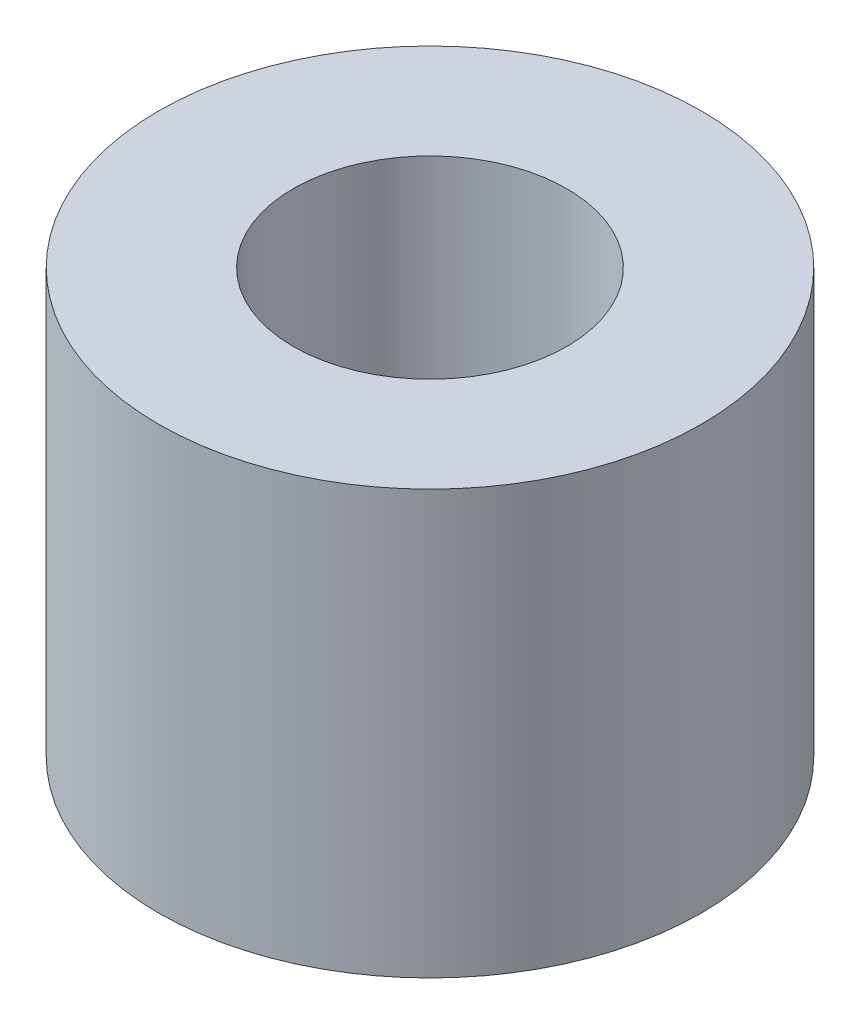
ISO-10303-21;
HEADER;
FILE_DESCRIPTION(('STEP AP214'),'2;1');
FILE_NAME('part.step','',(''),(''),'','','');
FILE_SCHEMA(('AUTOMOTIVE_DESIGN { 1 0 10303 214 1 1 1 1 }'));
ENDSEC;
DATA;
#1=APPLICATION_CONTEXT('core data for automotive mechanical design processes');
#2=APPLICATION_PROTOCOL_DEFINITION('international standard','automotive_design',2000,#1);
#3=PRODUCT_CONTEXT('',#1,'mechanical');
#4=PRODUCT('Part','Part','',(#3));
#5=PRODUCT_RELATED_PRODUCT_CATEGORY('part','',(#4));
#6=PRODUCT_DEFINITION_FORMATION('','',#4);
#7=PRODUCT_DEFINITION_CONTEXT('part definition',#1,'design');
#8=PRODUCT_DEFINITION('design','',#6,#7);
#9=PRODUCT_DEFINITION_SHAPE('','',#8);
#10=(LENGTH_UNIT() NAMED_UNIT(*) SI_UNIT(.MILLI.,.METRE.));
#11=(NAMED_UNIT(*) PLANE_ANGLE_UNIT() SI_UNIT($,.RADIAN.));
#12=(NAMED_UNIT(*) SI_UNIT($,.STERADIAN.) SOLID_ANGLE_UNIT());
#13=UNCERTAINTY_MEASURE_WITH_UNIT(LENGTH_MEASURE(1.E-05),#10,'distance_accuracy_value','');
#14=(GEOMETRIC_REPRESENTATION_CONTEXT(3) GLOBAL_UNCERTAINTY_ASSIGNED_CONTEXT((#13)) GLOBAL_UNIT_ASSIGNED_CONTEXT((#10,
#11,#12)) REPRESENTATION_CONTEXT('',''));
#15=CARTESIAN_POINT('',(0.,0.,0.));
#16=DIRECTION('',(0.,0.,1.));
#17=DIRECTION('',(1.,0.,0.));
#18=AXIS2_PLACEMENT_3D('',#15,#16,#17);
#19=CARTESIAN_POINT('',(0.,9.75,0.));
#20=DIRECTION('',(0.,1.,0.));
#21=DIRECTION('',(0.,0.,1.));
#22=AXIS2_PLACEMENT_3D('',#19,#20,#21);
#23=PLANE('',#22);
#24=CARTESIAN_POINT('',(0.,9.75,0.));
#25=DIRECTION('',(0.,1.,0.));
#26=DIRECTION('',(0.,0.,1.));
#27=AXIS2_PLACEMENT_3D('',#24,#25,#26);
#28=CIRCLE('',#27,6.25);
#29=CARTESIAN_POINT('',(0.,9.75,6.25));
#30=VERTEX_POINT('',#29);
#31=EDGE_CURVE('E10',#30,#30,#28,.T.);
#32=ORIENTED_EDGE('',*,*,#31,.T.);
#33=EDGE_LOOP('',(#32));
#34=FACE_BOUND('',#33,.T.);
#35=CARTESIAN_POINT('',(0.,9.75,0.));
#36=DIRECTION('',(0.,1.,0.));
#37=DIRECTION('',(0.,0.,1.));
#38=AXIS2_PLACEMENT_3D('',#35,#36,#37);
#39=CIRCLE('',#38,3.15);
#40=CARTESIAN_POINT('',(0.,9.75,3.15));
#41=VERTEX_POINT('',#40);
#42=EDGE_CURVE('E42',#41,#41,#39,.T.);
#43=ORIENTED_EDGE('',*,*,#42,.F.);
#44=EDGE_LOOP('',(#43));
#45=FACE_BOUND('',#44,.T.);
#46=ADVANCED_FACE('F31',(#34,#45),#23,.T.);
#47=CARTESIAN_POINT('',(0.,0.,0.));
#48=DIRECTION('',(0.,1.,0.));
#49=DIRECTION('',(0.,0.,1.));
#50=AXIS2_PLACEMENT_3D('',#47,#48,#49);
#51=PLANE('',#50);
#52=CARTESIAN_POINT('',(0.,0.,0.));
#53=DIRECTION('',(0.,1.,0.));
#54=DIRECTION('',(0.,0.,1.));
#55=AXIS2_PLACEMENT_3D('',#52,#53,#54);
#56=CIRCLE('',#55,6.25);
#57=CARTESIAN_POINT('',(0.,0.,6.25));
#58=VERTEX_POINT('',#57);
#59=EDGE_CURVE('E35',#58,#58,#56,.T.);
#60=ORIENTED_EDGE('',*,*,#59,.F.);
#61=EDGE_LOOP('',(#60));
#62=FACE_BOUND('',#61,.T.);
#63=CARTESIAN_POINT('',(0.,0.,0.));
#64=DIRECTION('',(0.,1.,0.));
#65=DIRECTION('',(0.,0.,1.));
#66=AXIS2_PLACEMENT_3D('',#63,#64,#65);
#67=CIRCLE('',#66,3.15);
#68=CARTESIAN_POINT('',(0.,0.,3.15));
#69=VERTEX_POINT('',#68);
#70=EDGE_CURVE('E44',#69,#69,#67,.T.);
#71=ORIENTED_EDGE('',*,*,#70,.T.);
#72=EDGE_LOOP('',(#71));
#73=FACE_BOUND('',#72,.T.);
#74=ADVANCED_FACE('F54',(#62,#73),#51,.F.);
#75=CARTESIAN_POINT('',(0.,9.75,0.));
#76=DIRECTION('',(0.,-1.,0.));
#77=DIRECTION('',(0.,0.,-1.));
#78=AXIS2_PLACEMENT_3D('',#75,#76,#77);
#79=CYLINDRICAL_SURFACE('',#78,6.25);
#80=ORIENTED_EDGE('',*,*,#31,.F.);
#81=EDGE_LOOP('',(#80));
#82=FACE_BOUND('',#81,.T.);
#83=ORIENTED_EDGE('',*,*,#59,.T.);
#84=EDGE_LOOP('',(#83));
#85=FACE_BOUND('',#84,.T.);
#86=ADVANCED_FACE('F33',(#82,#85),#79,.T.);
#87=CARTESIAN_POINT('',(0.,9.75,0.));
#88=DIRECTION('',(0.,-1.,0.));
#89=DIRECTION('',(0.,0.,-1.));
#90=AXIS2_PLACEMENT_3D('',#87,#88,#89);
#91=CYLINDRICAL_SURFACE('',#90,3.15);
#92=ORIENTED_EDGE('',*,*,#42,.T.);
#93=EDGE_LOOP('',(#92));
#94=FACE_BOUND('',#93,.T.);
#95=ORIENTED_EDGE('',*,*,#70,.F.);
#96=EDGE_LOOP('',(#95));
#97=FACE_BOUND('',#96,.T.);
#98=ADVANCED_FACE('F50',(#94,#97),#91,.F.);
#99=CLOSED_SHELL('',(#46,#74,#86,#98));
#100=MANIFOLD_SOLID_BREP('B2',#99);
#101=ADVANCED_BREP_SHAPE_REPRESENTATION('',(#18,#100),#14);
#102=SHAPE_DEFINITION_REPRESENTATION(#9,#101);
ENDSEC;
END-ISO-10303-21;
